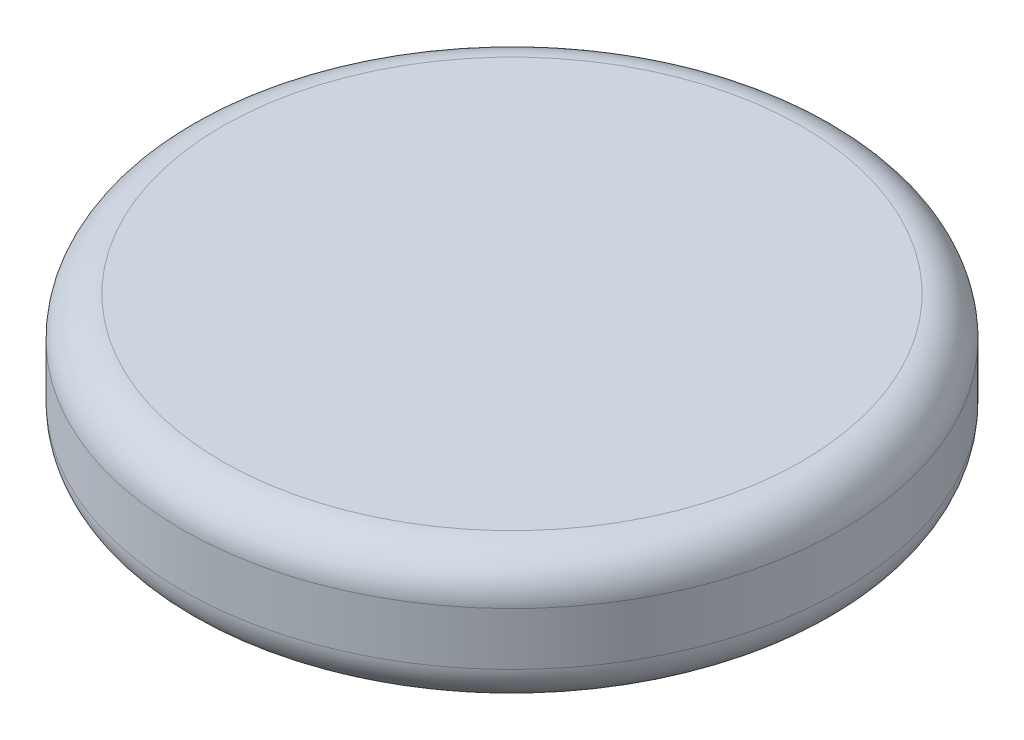
ISO-10303-21;
HEADER;
FILE_DESCRIPTION(('STEP AP214'),'2;1');
FILE_NAME('part.step','',(''),(''),'','','');
FILE_SCHEMA(('AUTOMOTIVE_DESIGN { 1 0 10303 214 1 1 1 1 }'));
ENDSEC;
DATA;
#1=APPLICATION_CONTEXT('core data for automotive mechanical design processes');
#2=APPLICATION_PROTOCOL_DEFINITION('international standard','automotive_design',2000,#1);
#3=PRODUCT_CONTEXT('',#1,'mechanical');
#4=PRODUCT('Part','Part','',(#3));
#5=PRODUCT_RELATED_PRODUCT_CATEGORY('part','',(#4));
#6=PRODUCT_DEFINITION_FORMATION('','',#4);
#7=PRODUCT_DEFINITION_CONTEXT('part definition',#1,'design');
#8=PRODUCT_DEFINITION('design','',#6,#7);
#9=PRODUCT_DEFINITION_SHAPE('','',#8);
#10=(LENGTH_UNIT() NAMED_UNIT(*) SI_UNIT(.MILLI.,.METRE.));
#11=(NAMED_UNIT(*) PLANE_ANGLE_UNIT() SI_UNIT($,.RADIAN.));
#12=(NAMED_UNIT(*) SI_UNIT($,.STERADIAN.) SOLID_ANGLE_UNIT());
#13=UNCERTAINTY_MEASURE_WITH_UNIT(LENGTH_MEASURE(1.E-05),#10,'distance_accuracy_value','');
#14=(GEOMETRIC_REPRESENTATION_CONTEXT(3) GLOBAL_UNCERTAINTY_ASSIGNED_CONTEXT((#13)) GLOBAL_UNIT_ASSIGNED_CONTEXT((#10,
#11,#12)) REPRESENTATION_CONTEXT('',''));
#15=CARTESIAN_POINT('',(0.,0.,0.));
#16=DIRECTION('',(0.,0.,1.));
#17=DIRECTION('',(1.,0.,0.));
#18=AXIS2_PLACEMENT_3D('',#15,#16,#17);
#19=CARTESIAN_POINT('',(0.,0.,0.));
#20=DIRECTION('',(0.,1.,0.));
#21=DIRECTION('',(0.,0.,1.));
#22=AXIS2_PLACEMENT_3D('',#19,#20,#21);
#23=PLANE('',#22);
#24=CARTESIAN_POINT('',(0.,0.,0.));
#25=DIRECTION('',(0.,1.,0.));
#26=DIRECTION('',(0.,0.,1.));
#27=AXIS2_PLACEMENT_3D('',#24,#25,#26);
#28=CIRCLE('',#27,22.);
#29=CARTESIAN_POINT('',(0.,0.,22.));
#30=VERTEX_POINT('',#29);
#31=EDGE_CURVE('E40',#30,#30,#28,.F.);
#32=ORIENTED_EDGE('',*,*,#31,.T.);
#33=EDGE_LOOP('',(#32));
#34=FACE_BOUND('',#33,.T.);
#35=DIRECTION('',(0.,0.,-1.));
#36=VECTOR('',#35,1.);
#37=CARTESIAN_POINT('',(-14.125,0.,14.125));
#38=LINE('',#37,#36);
#39=CARTESIAN_POINT('',(-14.125,0.,14.125));
#40=VERTEX_POINT('',#39);
#41=CARTESIAN_POINT('',(-14.125,0.,-14.125));
#42=VERTEX_POINT('',#41);
#43=EDGE_CURVE('E93',#40,#42,#38,.T.);
#44=ORIENTED_EDGE('',*,*,#43,.F.);
#45=DIRECTION('',(-1.,0.,0.));
#46=VECTOR('',#45,1.);
#47=CARTESIAN_POINT('',(14.125,0.,14.125));
#48=LINE('',#47,#46);
#49=CARTESIAN_POINT('',(14.125,0.,14.125));
#50=VERTEX_POINT('',#49);
#51=EDGE_CURVE('E90',#50,#40,#48,.T.);
#52=ORIENTED_EDGE('',*,*,#51,.F.);
#53=DIRECTION('',(0.,0.,1.));
#54=VECTOR('',#53,1.);
#55=CARTESIAN_POINT('',(14.125,0.,14.125));
#56=LINE('',#55,#54);
#57=CARTESIAN_POINT('',(14.125,0.,-14.125));
#58=VERTEX_POINT('',#57);
#59=EDGE_CURVE('E52',#58,#50,#56,.T.);
#60=ORIENTED_EDGE('',*,*,#59,.F.);
#61=DIRECTION('',(1.,0.,0.));
#62=VECTOR('',#61,1.);
#63=CARTESIAN_POINT('',(14.125,0.,-14.125));
#64=LINE('',#63,#62);
#65=EDGE_CURVE('E47',#42,#58,#64,.T.);
#66=ORIENTED_EDGE('',*,*,#65,.F.);
#67=EDGE_LOOP('',(#44,#52,#60,#66));
#68=FACE_BOUND('',#67,.T.);
#69=ADVANCED_FACE('F32',(#34,#68),#23,.F.);
#70=CARTESIAN_POINT('',(0.,10.,0.));
#71=DIRECTION('',(0.,-1.,0.));
#72=DIRECTION('',(0.,0.,-1.));
#73=AXIS2_PLACEMENT_3D('',#70,#71,#72);
#74=CYLINDRICAL_SURFACE('',#73,25.);
#75=CARTESIAN_POINT('',(0.,3.,0.));
#76=DIRECTION('',(0.,1.,0.));
#77=DIRECTION('',(0.,0.,1.));
#78=AXIS2_PLACEMENT_3D('',#75,#76,#77);
#79=CIRCLE('',#78,25.);
#80=CARTESIAN_POINT('',(0.,3.,25.));
#81=VERTEX_POINT('',#80);
#82=EDGE_CURVE('E97',#81,#81,#79,.T.);
#83=ORIENTED_EDGE('',*,*,#82,.T.);
#84=EDGE_LOOP('',(#83));
#85=FACE_BOUND('',#84,.T.);
#86=CARTESIAN_POINT('',(0.,7.,0.));
#87=DIRECTION('',(0.,1.,0.));
#88=DIRECTION('',(0.,0.,1.));
#89=AXIS2_PLACEMENT_3D('',#86,#87,#88);
#90=CIRCLE('',#89,25.);
#91=CARTESIAN_POINT('',(0.,7.,25.));
#92=VERTEX_POINT('',#91);
#93=EDGE_CURVE('E94',#92,#92,#90,.F.);
#94=ORIENTED_EDGE('',*,*,#93,.T.);
#95=EDGE_LOOP('',(#94));
#96=FACE_BOUND('',#95,.T.);
#97=ADVANCED_FACE('F114',(#85,#96),#74,.T.);
#98=CARTESIAN_POINT('',(0.,10.,0.));
#99=DIRECTION('',(0.,1.,0.));
#100=DIRECTION('',(0.,0.,1.));
#101=AXIS2_PLACEMENT_3D('',#98,#99,#100);
#102=PLANE('',#101);
#103=CARTESIAN_POINT('',(0.,10.,0.));
#104=DIRECTION('',(0.,1.,0.));
#105=DIRECTION('',(0.,0.,1.));
#106=AXIS2_PLACEMENT_3D('',#103,#104,#105);
#107=CIRCLE('',#106,22.);
#108=CARTESIAN_POINT('',(0.,10.,22.));
#109=VERTEX_POINT('',#108);
#110=EDGE_CURVE('E11',#109,#109,#107,.T.);
#111=ORIENTED_EDGE('',*,*,#110,.T.);
#112=EDGE_LOOP('',(#111));
#113=FACE_BOUND('',#112,.T.);
#114=ADVANCED_FACE('F111',(#113),#102,.T.);
#115=CARTESIAN_POINT('',(0.,3.,0.));
#116=DIRECTION('',(0.,1.,0.));
#117=DIRECTION('',(0.,0.,1.));
#118=AXIS2_PLACEMENT_3D('',#115,#116,#117);
#119=TOROIDAL_SURFACE('',#118,22.,3.);
#120=ORIENTED_EDGE('',*,*,#31,.F.);
#121=EDGE_LOOP('',(#120));
#122=FACE_BOUND('',#121,.T.);
#123=ORIENTED_EDGE('',*,*,#82,.F.);
#124=EDGE_LOOP('',(#123));
#125=FACE_BOUND('',#124,.T.);
#126=ADVANCED_FACE('F108',(#122,#125),#119,.T.);
#127=CARTESIAN_POINT('',(0.,7.,0.));
#128=DIRECTION('',(0.,1.,0.));
#129=DIRECTION('',(0.,0.,1.));
#130=AXIS2_PLACEMENT_3D('',#127,#128,#129);
#131=TOROIDAL_SURFACE('',#130,22.,3.);
#132=ORIENTED_EDGE('',*,*,#93,.F.);
#133=EDGE_LOOP('',(#132));
#134=FACE_BOUND('',#133,.T.);
#135=ORIENTED_EDGE('',*,*,#110,.F.);
#136=EDGE_LOOP('',(#135));
#137=FACE_BOUND('',#136,.T.);
#138=ADVANCED_FACE('F34',(#134,#137),#131,.T.);
#139=CARTESIAN_POINT('',(-14.125,-1.,14.125));
#140=DIRECTION('',(1.,0.,0.));
#141=DIRECTION('',(0.,0.,-1.));
#142=AXIS2_PLACEMENT_3D('',#139,#140,#141);
#143=PLANE('',#142);
#144=ORIENTED_EDGE('',*,*,#43,.T.);
#145=DIRECTION('',(0.,1.,0.));
#146=VECTOR('',#145,1.);
#147=CARTESIAN_POINT('',(-14.125,-1.,-14.125));
#148=LINE('',#147,#146);
#149=CARTESIAN_POINT('',(-14.125,-1.,-14.125));
#150=VERTEX_POINT('',#149);
#151=EDGE_CURVE('E74',#150,#42,#148,.T.);
#152=ORIENTED_EDGE('',*,*,#151,.F.);
#153=DIRECTION('',(0.,0.,-1.));
#154=VECTOR('',#153,1.);
#155=CARTESIAN_POINT('',(-14.125,-1.,14.125));
#156=LINE('',#155,#154);
#157=CARTESIAN_POINT('',(-14.125,-1.,14.125));
#158=VERTEX_POINT('',#157);
#159=EDGE_CURVE('E81',#158,#150,#156,.T.);
#160=ORIENTED_EDGE('',*,*,#159,.F.);
#161=DIRECTION('',(0.,1.,0.));
#162=VECTOR('',#161,1.);
#163=CARTESIAN_POINT('',(-14.125,-1.,14.125));
#164=LINE('',#163,#162);
#165=EDGE_CURVE('E204',#158,#40,#164,.T.);
#166=ORIENTED_EDGE('',*,*,#165,.T.);
#167=EDGE_LOOP('',(#144,#152,#160,#166));
#168=FACE_BOUND('',#167,.T.);
#169=ADVANCED_FACE('F92',(#168),#143,.F.);
#170=CARTESIAN_POINT('',(14.125,-1.,-14.125));
#171=DIRECTION('',(0.,0.,1.));
#172=DIRECTION('',(1.,0.,0.));
#173=AXIS2_PLACEMENT_3D('',#170,#171,#172);
#174=PLANE('',#173);
#175=ORIENTED_EDGE('',*,*,#65,.T.);
#176=DIRECTION('',(0.,1.,0.));
#177=VECTOR('',#176,1.);
#178=CARTESIAN_POINT('',(14.125,-1.,-14.125));
#179=LINE('',#178,#177);
#180=CARTESIAN_POINT('',(14.125,-1.,-14.125));
#181=VERTEX_POINT('',#180);
#182=EDGE_CURVE('E77',#181,#58,#179,.T.);
#183=ORIENTED_EDGE('',*,*,#182,.F.);
#184=DIRECTION('',(1.,0.,0.));
#185=VECTOR('',#184,1.);
#186=CARTESIAN_POINT('',(14.125,-1.,-14.125));
#187=LINE('',#186,#185);
#188=EDGE_CURVE('E70',#150,#181,#187,.T.);
#189=ORIENTED_EDGE('',*,*,#188,.F.);
#190=ORIENTED_EDGE('',*,*,#151,.T.);
#191=EDGE_LOOP('',(#175,#183,#189,#190));
#192=FACE_BOUND('',#191,.T.);
#193=ADVANCED_FACE('F72',(#192),#174,.F.);
#194=CARTESIAN_POINT('',(14.125,-1.,14.125));
#195=DIRECTION('',(-1.,0.,0.));
#196=DIRECTION('',(0.,0.,1.));
#197=AXIS2_PLACEMENT_3D('',#194,#195,#196);
#198=PLANE('',#197);
#199=ORIENTED_EDGE('',*,*,#59,.T.);
#200=DIRECTION('',(0.,1.,0.));
#201=VECTOR('',#200,1.);
#202=CARTESIAN_POINT('',(14.125,-1.,14.125));
#203=LINE('',#202,#201);
#204=CARTESIAN_POINT('',(14.125,-1.,14.125));
#205=VERTEX_POINT('',#204);
#206=EDGE_CURVE('E99',#205,#50,#203,.T.);
#207=ORIENTED_EDGE('',*,*,#206,.F.);
#208=DIRECTION('',(0.,0.,1.));
#209=VECTOR('',#208,1.);
#210=CARTESIAN_POINT('',(14.125,-1.,14.125));
#211=LINE('',#210,#209);
#212=EDGE_CURVE('E80',#181,#205,#211,.T.);
#213=ORIENTED_EDGE('',*,*,#212,.F.);
#214=ORIENTED_EDGE('',*,*,#182,.T.);
#215=EDGE_LOOP('',(#199,#207,#213,#214));
#216=FACE_BOUND('',#215,.T.);
#217=ADVANCED_FACE('F166',(#216),#198,.F.);
#218=CARTESIAN_POINT('',(14.125,-1.,14.125));
#219=DIRECTION('',(0.,0.,-1.));
#220=DIRECTION('',(-1.,0.,0.));
#221=AXIS2_PLACEMENT_3D('',#218,#219,#220);
#222=PLANE('',#221);
#223=ORIENTED_EDGE('',*,*,#51,.T.);
#224=ORIENTED_EDGE('',*,*,#165,.F.);
#225=DIRECTION('',(-1.,0.,0.));
#226=VECTOR('',#225,1.);
#227=CARTESIAN_POINT('',(14.125,-1.,14.125));
#228=LINE('',#227,#226);
#229=EDGE_CURVE('E86',#205,#158,#228,.T.);
#230=ORIENTED_EDGE('',*,*,#229,.F.);
#231=ORIENTED_EDGE('',*,*,#206,.T.);
#232=EDGE_LOOP('',(#223,#224,#230,#231));
#233=FACE_BOUND('',#232,.T.);
#234=ADVANCED_FACE('F173',(#233),#222,.F.);
#235=CARTESIAN_POINT('',(0.,-1.,0.));
#236=DIRECTION('',(0.,1.,0.));
#237=DIRECTION('',(0.,0.,1.));
#238=AXIS2_PLACEMENT_3D('',#235,#236,#237);
#239=PLANE('',#238);
#240=ORIENTED_EDGE('',*,*,#159,.T.);
#241=ORIENTED_EDGE('',*,*,#188,.T.);
#242=ORIENTED_EDGE('',*,*,#212,.T.);
#243=ORIENTED_EDGE('',*,*,#229,.T.);
#244=EDGE_LOOP('',(#240,#241,#242,#243));
#245=FACE_BOUND('',#244,.T.);
#246=ADVANCED_FACE('F84',(#245),#239,.F.);
#247=CLOSED_SHELL('',(#69,#97,#114,#126,#138,#169,#193,#217,#234,#246));
#248=MANIFOLD_SOLID_BREP('B2',#247);
#249=ADVANCED_BREP_SHAPE_REPRESENTATION('',(#18,#248),#14);
#250=SHAPE_DEFINITION_REPRESENTATION(#9,#249);
ENDSEC;
END-ISO-10303-21;
